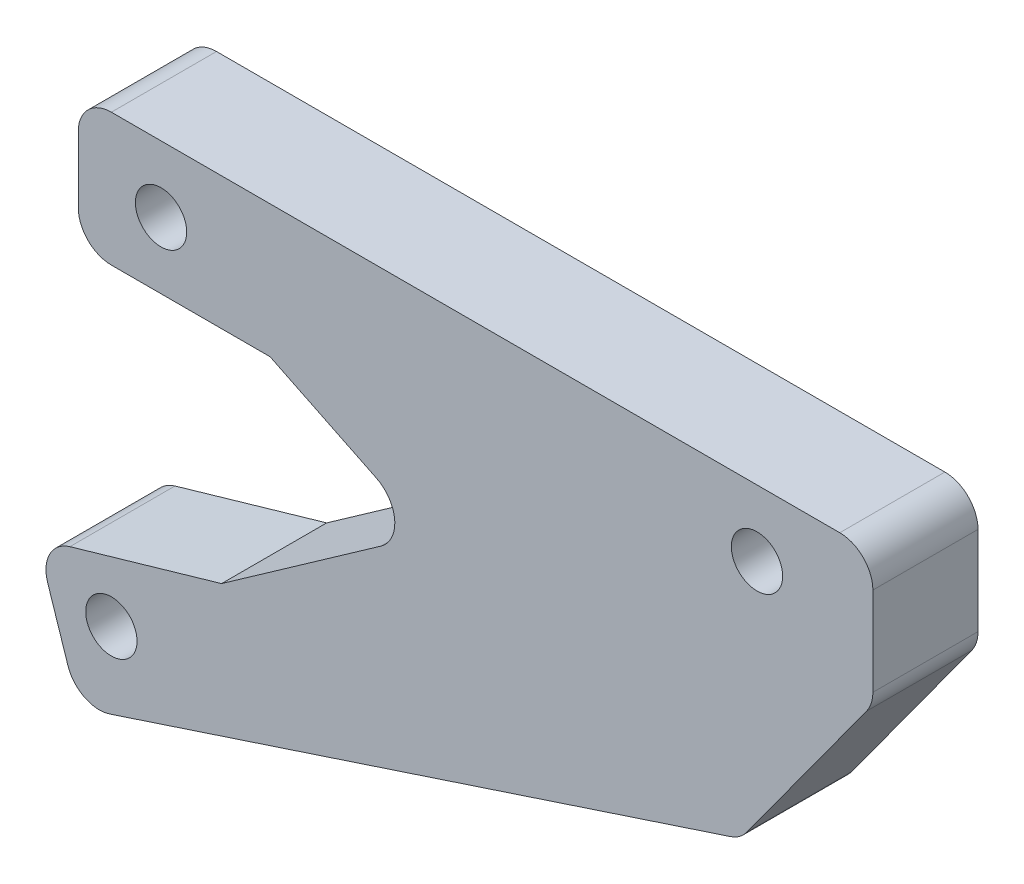
ISO-10303-21;
HEADER;
FILE_DESCRIPTION(('STEP AP214'),'2;1');
FILE_NAME('part.step','',(''),(''),'','','');
FILE_SCHEMA(('AUTOMOTIVE_DESIGN { 1 0 10303 214 1 1 1 1 }'));
ENDSEC;
DATA;
#1=APPLICATION_CONTEXT('core data for automotive mechanical design processes');
#2=APPLICATION_PROTOCOL_DEFINITION('international standard','automotive_design',2000,#1);
#3=PRODUCT_CONTEXT('',#1,'mechanical');
#4=PRODUCT('Part','Part','',(#3));
#5=PRODUCT_RELATED_PRODUCT_CATEGORY('part','',(#4));
#6=PRODUCT_DEFINITION_FORMATION('','',#4);
#7=PRODUCT_DEFINITION_CONTEXT('part definition',#1,'design');
#8=PRODUCT_DEFINITION('design','',#6,#7);
#9=PRODUCT_DEFINITION_SHAPE('','',#8);
#10=(LENGTH_UNIT() NAMED_UNIT(*) SI_UNIT(.MILLI.,.METRE.));
#11=(NAMED_UNIT(*) PLANE_ANGLE_UNIT() SI_UNIT($,.RADIAN.));
#12=(NAMED_UNIT(*) SI_UNIT($,.STERADIAN.) SOLID_ANGLE_UNIT());
#13=UNCERTAINTY_MEASURE_WITH_UNIT(LENGTH_MEASURE(1.E-05),#10,'distance_accuracy_value','');
#14=(GEOMETRIC_REPRESENTATION_CONTEXT(3) GLOBAL_UNCERTAINTY_ASSIGNED_CONTEXT((#13)) GLOBAL_UNIT_ASSIGNED_CONTEXT((#10,
#11,#12)) REPRESENTATION_CONTEXT('',''));
#15=CARTESIAN_POINT('',(0.,0.,0.));
#16=DIRECTION('',(0.,0.,1.));
#17=DIRECTION('',(1.,0.,0.));
#18=AXIS2_PLACEMENT_3D('',#15,#16,#17);
#19=CARTESIAN_POINT('',(24.,4.,6.35));
#20=DIRECTION('',(-1.,0.,0.));
#21=DIRECTION('',(0.,-1.,0.));
#22=AXIS2_PLACEMENT_3D('',#19,#20,#21);
#23=PLANE('',#22);
#24=DIRECTION('',(0.,1.,0.));
#25=VECTOR('',#24,1.);
#26=CARTESIAN_POINT('',(24.,4.,6.35));
#27=LINE('',#26,#25);
#28=CARTESIAN_POINT('',(24.,-3.34963237281614,6.35));
#29=VERTEX_POINT('',#28);
#30=CARTESIAN_POINT('',(24.,2.,6.35));
#31=VERTEX_POINT('',#30);
#32=EDGE_CURVE('E205',#29,#31,#27,.T.);
#33=ORIENTED_EDGE('',*,*,#32,.F.);
#34=DIRECTION('',(0.,0.,-1.));
#35=VECTOR('',#34,1.);
#36=CARTESIAN_POINT('',(24.,-3.34963237281614,6.35));
#37=LINE('',#36,#35);
#38=CARTESIAN_POINT('',(24.,-3.34963237281614,0.));
#39=VERTEX_POINT('',#38);
#40=EDGE_CURVE('E310',#29,#39,#37,.T.);
#41=ORIENTED_EDGE('',*,*,#40,.T.);
#42=DIRECTION('',(0.,1.,0.));
#43=VECTOR('',#42,1.);
#44=CARTESIAN_POINT('',(24.,4.,0.));
#45=LINE('',#44,#43);
#46=CARTESIAN_POINT('',(24.,2.,0.));
#47=VERTEX_POINT('',#46);
#48=EDGE_CURVE('E226',#39,#47,#45,.T.);
#49=ORIENTED_EDGE('',*,*,#48,.T.);
#50=DIRECTION('',(0.,0.,-1.));
#51=VECTOR('',#50,1.);
#52=CARTESIAN_POINT('',(24.,2.,6.35));
#53=LINE('',#52,#51);
#54=EDGE_CURVE('E50',#47,#31,#53,.F.);
#55=ORIENTED_EDGE('',*,*,#54,.T.);
#56=EDGE_LOOP('',(#33,#41,#49,#55));
#57=FACE_BOUND('',#56,.T.);
#58=ADVANCED_FACE('F35',(#57),#23,.F.);
#59=CARTESIAN_POINT('',(-24.,4.,6.35));
#60=DIRECTION('',(0.,-1.,0.));
#61=DIRECTION('',(0.,0.,-1.));
#62=AXIS2_PLACEMENT_3D('',#59,#60,#61);
#63=PLANE('',#62);
#64=DIRECTION('',(-1.,0.,0.));
#65=VECTOR('',#64,1.);
#66=CARTESIAN_POINT('',(-24.,4.,0.));
#67=LINE('',#66,#65);
#68=CARTESIAN_POINT('',(22.,4.,0.));
#69=VERTEX_POINT('',#68);
#70=CARTESIAN_POINT('',(-22.,4.,0.));
#71=VERTEX_POINT('',#70);
#72=EDGE_CURVE('E228',#69,#71,#67,.T.);
#73=ORIENTED_EDGE('',*,*,#72,.T.);
#74=DIRECTION('',(0.,0.,-1.));
#75=VECTOR('',#74,1.);
#76=CARTESIAN_POINT('',(-22.,4.,6.35));
#77=LINE('',#76,#75);
#78=CARTESIAN_POINT('',(-22.,4.,6.35));
#79=VERTEX_POINT('',#78);
#80=EDGE_CURVE('E274',#71,#79,#77,.F.);
#81=ORIENTED_EDGE('',*,*,#80,.T.);
#82=DIRECTION('',(-1.,0.,0.));
#83=VECTOR('',#82,1.);
#84=CARTESIAN_POINT('',(-24.,4.,6.35));
#85=LINE('',#84,#83);
#86=CARTESIAN_POINT('',(22.,4.,6.35));
#87=VERTEX_POINT('',#86);
#88=EDGE_CURVE('E207',#87,#79,#85,.T.);
#89=ORIENTED_EDGE('',*,*,#88,.F.);
#90=DIRECTION('',(0.,0.,-1.));
#91=VECTOR('',#90,1.);
#92=CARTESIAN_POINT('',(22.,4.,6.35));
#93=LINE('',#92,#91);
#94=EDGE_CURVE('E271',#87,#69,#93,.T.);
#95=ORIENTED_EDGE('',*,*,#94,.T.);
#96=EDGE_LOOP('',(#73,#81,#89,#95));
#97=FACE_BOUND('',#96,.T.);
#98=ADVANCED_FACE('F346',(#97),#63,.F.);
#99=CARTESIAN_POINT('',(-24.,4.,6.35));
#100=DIRECTION('',(1.,0.,0.));
#101=DIRECTION('',(0.,0.,-1.));
#102=AXIS2_PLACEMENT_3D('',#99,#100,#101);
#103=PLANE('',#102);
#104=DIRECTION('',(0.,-1.,0.));
#105=VECTOR('',#104,1.);
#106=CARTESIAN_POINT('',(-24.,4.,6.35));
#107=LINE('',#106,#105);
#108=CARTESIAN_POINT('',(-24.,2.,6.35));
#109=VERTEX_POINT('',#108);
#110=CARTESIAN_POINT('',(-24.,-2.,6.35));
#111=VERTEX_POINT('',#110);
#112=EDGE_CURVE('E211',#109,#111,#107,.T.);
#113=ORIENTED_EDGE('',*,*,#112,.F.);
#114=DIRECTION('',(0.,0.,-1.));
#115=VECTOR('',#114,1.);
#116=CARTESIAN_POINT('',(-24.,2.,6.35));
#117=LINE('',#116,#115);
#118=CARTESIAN_POINT('',(-24.,2.,0.));
#119=VERTEX_POINT('',#118);
#120=EDGE_CURVE('E255',#109,#119,#117,.T.);
#121=ORIENTED_EDGE('',*,*,#120,.T.);
#122=DIRECTION('',(0.,-1.,0.));
#123=VECTOR('',#122,1.);
#124=CARTESIAN_POINT('',(-24.,4.,0.));
#125=LINE('',#124,#123);
#126=CARTESIAN_POINT('',(-24.,-2.,0.));
#127=VERTEX_POINT('',#126);
#128=EDGE_CURVE('E232',#119,#127,#125,.T.);
#129=ORIENTED_EDGE('',*,*,#128,.T.);
#130=DIRECTION('',(0.,0.,-1.));
#131=VECTOR('',#130,1.);
#132=CARTESIAN_POINT('',(-24.,-2.,6.35));
#133=LINE('',#132,#131);
#134=EDGE_CURVE('E253',#127,#111,#133,.F.);
#135=ORIENTED_EDGE('',*,*,#134,.T.);
#136=EDGE_LOOP('',(#113,#121,#129,#135));
#137=FACE_BOUND('',#136,.T.);
#138=ADVANCED_FACE('F336',(#137),#103,.F.);
#139=CARTESIAN_POINT('',(-24.,-4.,6.35));
#140=DIRECTION('',(0.,1.,0.));
#141=DIRECTION('',(0.,0.,1.));
#142=AXIS2_PLACEMENT_3D('',#139,#140,#141);
#143=PLANE('',#142);
#144=DIRECTION('',(1.,0.,0.));
#145=VECTOR('',#144,1.);
#146=CARTESIAN_POINT('',(-24.,-4.,6.35));
#147=LINE('',#146,#145);
#148=CARTESIAN_POINT('',(-22.,-4.,6.35));
#149=VERTEX_POINT('',#148);
#150=CARTESIAN_POINT('',(-12.4163745866691,-4.,6.35));
#151=VERTEX_POINT('',#150);
#152=EDGE_CURVE('E214',#149,#151,#147,.T.);
#153=ORIENTED_EDGE('',*,*,#152,.F.);
#154=DIRECTION('',(0.,0.,-1.));
#155=VECTOR('',#154,1.);
#156=CARTESIAN_POINT('',(-22.,-4.,6.35));
#157=LINE('',#156,#155);
#158=CARTESIAN_POINT('',(-22.,-4.,0.));
#159=VERTEX_POINT('',#158);
#160=EDGE_CURVE('E289',#149,#159,#157,.T.);
#161=ORIENTED_EDGE('',*,*,#160,.T.);
#162=DIRECTION('',(1.,0.,0.));
#163=VECTOR('',#162,1.);
#164=CARTESIAN_POINT('',(-24.,-4.,0.));
#165=LINE('',#164,#163);
#166=CARTESIAN_POINT('',(-12.4163745866691,-4.,0.));
#167=VERTEX_POINT('',#166);
#168=EDGE_CURVE('E173',#159,#167,#165,.T.);
#169=ORIENTED_EDGE('',*,*,#168,.T.);
#170=DIRECTION('',(0.,0.,1.));
#171=VECTOR('',#170,1.);
#172=CARTESIAN_POINT('',(-12.4163745866691,-4.,-32.2295189347304));
#173=LINE('',#172,#171);
#174=EDGE_CURVE('E183',#167,#151,#173,.T.);
#175=ORIENTED_EDGE('',*,*,#174,.T.);
#176=EDGE_LOOP('',(#153,#161,#169,#175));
#177=FACE_BOUND('',#176,.T.);
#178=ADVANCED_FACE('F330',(#177),#143,.F.);
#179=CARTESIAN_POINT('',(-26.5,-20.5596918224101,6.35));
#180=DIRECTION('',(0.277910002796559,-0.960607115498119,0.));
#181=DIRECTION('',(0.960607115498119,0.27791000279656,0.));
#182=AXIS2_PLACEMENT_3D('',#179,#180,#181);
#183=PLANE('',#182);
#184=DIRECTION('',(-0.960607115498119,-0.27791000279656,0.));
#185=VECTOR('',#184,1.);
#186=CARTESIAN_POINT('',(-26.5,-20.5596918224101,0.));
#187=LINE('',#186,#185);
#188=CARTESIAN_POINT('',(-15.3428605825562,-17.3318574698657,0.));
#189=VERTEX_POINT('',#188);
#190=CARTESIAN_POINT('',(-24.5079359802819,-19.9833745035406,0.));
#191=VERTEX_POINT('',#190);
#192=EDGE_CURVE('E161',#189,#191,#187,.T.);
#193=ORIENTED_EDGE('',*,*,#192,.T.);
#194=DIRECTION('',(0.,0.,-1.));
#195=VECTOR('',#194,1.);
#196=CARTESIAN_POINT('',(-24.5079359802819,-19.9833745035406,6.35));
#197=LINE('',#196,#195);
#198=CARTESIAN_POINT('',(-24.5079359802819,-19.9833745035406,6.35));
#199=VERTEX_POINT('',#198);
#200=EDGE_CURVE('E297',#191,#199,#197,.F.);
#201=ORIENTED_EDGE('',*,*,#200,.T.);
#202=DIRECTION('',(-0.960607115498119,-0.27791000279656,0.));
#203=VECTOR('',#202,1.);
#204=CARTESIAN_POINT('',(-26.5,-20.5596918224101,6.35));
#205=LINE('',#204,#203);
#206=CARTESIAN_POINT('',(-15.3428605825562,-17.3318574698657,6.35));
#207=VERTEX_POINT('',#206);
#208=EDGE_CURVE('E180',#207,#199,#205,.T.);
#209=ORIENTED_EDGE('',*,*,#208,.F.);
#210=DIRECTION('',(0.,0.,1.));
#211=VECTOR('',#210,1.);
#212=CARTESIAN_POINT('',(-15.3428605825562,-17.3318574698657,-32.2295189347304));
#213=LINE('',#212,#211);
#214=EDGE_CURVE('E177',#189,#207,#213,.T.);
#215=ORIENTED_EDGE('',*,*,#214,.F.);
#216=EDGE_LOOP('',(#193,#201,#209,#215));
#217=FACE_BOUND('',#216,.T.);
#218=ADVANCED_FACE('F178',(#217),#183,.F.);
#219=CARTESIAN_POINT('',(-24.,-28.1590338991954,6.35));
#220=DIRECTION('',(0.949917759598166,0.312500000000001,0.));
#221=DIRECTION('',(-0.312500000000001,0.949917759598166,0.));
#222=AXIS2_PLACEMENT_3D('',#219,#220,#221);
#223=PLANE('',#222);
#224=DIRECTION('',(0.312500000000001,-0.949917759598166,0.));
#225=VECTOR('',#224,1.);
#226=CARTESIAN_POINT('',(-24.,-28.1590338991954,6.35));
#227=LINE('',#226,#225);
#228=CARTESIAN_POINT('',(-25.8519514938851,-22.5295887345369,6.35));
#229=VERTEX_POINT('',#228);
#230=CARTESIAN_POINT('',(-24.625,-26.2591983799991,6.35));
#231=VERTEX_POINT('',#230);
#232=EDGE_CURVE('E217',#229,#231,#227,.T.);
#233=ORIENTED_EDGE('',*,*,#232,.F.);
#234=DIRECTION('',(0.,0.,-1.));
#235=VECTOR('',#234,1.);
#236=CARTESIAN_POINT('',(-25.8519514938851,-22.5295887345369,6.35));
#237=LINE('',#236,#235);
#238=CARTESIAN_POINT('',(-25.8519514938851,-22.5295887345369,0.));
#239=VERTEX_POINT('',#238);
#240=EDGE_CURVE('E294',#229,#239,#237,.T.);
#241=ORIENTED_EDGE('',*,*,#240,.T.);
#242=DIRECTION('',(0.312500000000001,-0.949917759598166,0.));
#243=VECTOR('',#242,1.);
#244=CARTESIAN_POINT('',(-24.,-28.1590338991954,0.));
#245=LINE('',#244,#243);
#246=CARTESIAN_POINT('',(-24.625,-26.2591983799991,0.));
#247=VERTEX_POINT('',#246);
#248=EDGE_CURVE('E172',#239,#247,#245,.T.);
#249=ORIENTED_EDGE('',*,*,#248,.T.);
#250=DIRECTION('',(0.,0.,-1.));
#251=VECTOR('',#250,1.);
#252=CARTESIAN_POINT('',(-24.625,-26.2591983799991,6.35));
#253=LINE('',#252,#251);
#254=EDGE_CURVE('E292',#247,#231,#253,.F.);
#255=ORIENTED_EDGE('',*,*,#254,.T.);
#256=EDGE_LOOP('',(#233,#241,#249,#255));
#257=FACE_BOUND('',#256,.T.);
#258=ADVANCED_FACE('F376',(#257),#223,.F.);
#259=CARTESIAN_POINT('',(16.,-15.,6.35));
#260=DIRECTION('',(-0.312500000000001,0.949917759598166,0.));
#261=DIRECTION('',(-0.949917759598166,-0.312500000000001,0.));
#262=AXIS2_PLACEMENT_3D('',#259,#260,#261);
#263=PLANE('',#262);
#264=DIRECTION('',(0.949917759598166,0.312500000000001,0.));
#265=VECTOR('',#264,1.);
#266=CARTESIAN_POINT('',(16.,-15.,6.35));
#267=LINE('',#266,#265);
#268=CARTESIAN_POINT('',(-22.1001644808037,-27.5340338991954,6.35));
#269=VERTEX_POINT('',#268);
#270=CARTESIAN_POINT('',(15.3870532468654,-15.2016446775725,6.35));
#271=VERTEX_POINT('',#270);
#272=EDGE_CURVE('E220',#269,#271,#267,.T.);
#273=ORIENTED_EDGE('',*,*,#272,.F.);
#274=DIRECTION('',(0.,0.,-1.));
#275=VECTOR('',#274,1.);
#276=CARTESIAN_POINT('',(-22.1001644808037,-27.5340338991954,6.35));
#277=LINE('',#276,#275);
#278=CARTESIAN_POINT('',(-22.1001644808037,-27.5340338991954,0.));
#279=VERTEX_POINT('',#278);
#280=EDGE_CURVE('E301',#269,#279,#277,.T.);
#281=ORIENTED_EDGE('',*,*,#280,.T.);
#282=DIRECTION('',(0.949917759598166,0.312500000000001,0.));
#283=VECTOR('',#282,1.);
#284=CARTESIAN_POINT('',(16.,-15.,0.));
#285=LINE('',#284,#283);
#286=CARTESIAN_POINT('',(15.3870532468654,-15.2016446775725,0.));
#287=VERTEX_POINT('',#286);
#288=EDGE_CURVE('E238',#279,#287,#285,.T.);
#289=ORIENTED_EDGE('',*,*,#288,.T.);
#290=DIRECTION('',(0.,0.,-1.));
#291=VECTOR('',#290,1.);
#292=CARTESIAN_POINT('',(15.3870532468654,-15.2016446775725,6.35));
#293=LINE('',#292,#291);
#294=EDGE_CURVE('E299',#287,#271,#293,.F.);
#295=ORIENTED_EDGE('',*,*,#294,.T.);
#296=EDGE_LOOP('',(#273,#281,#289,#295));
#297=FACE_BOUND('',#296,.T.);
#298=ADVANCED_FACE('F368',(#297),#263,.F.);
#299=CARTESIAN_POINT('',(24.,-4.,6.35));
#300=DIRECTION('',(-0.808736084303188,0.588171697675047,0.));
#301=DIRECTION('',(-0.588171697675047,-0.808736084303188,0.));
#302=AXIS2_PLACEMENT_3D('',#299,#300,#301);
#303=PLANE('',#302);
#304=DIRECTION('',(0.588171697675047,0.808736084303188,0.));
#305=VECTOR('',#304,1.);
#306=CARTESIAN_POINT('',(24.,-4.,6.35));
#307=LINE('',#306,#305);
#308=CARTESIAN_POINT('',(16.3795254154718,-14.4781525537262,6.35));
#309=VERTEX_POINT('',#308);
#310=CARTESIAN_POINT('',(23.6174721686064,-4.52597576816623,6.35));
#311=VERTEX_POINT('',#310);
#312=EDGE_CURVE('E223',#309,#311,#307,.T.);
#313=ORIENTED_EDGE('',*,*,#312,.F.);
#314=DIRECTION('',(0.,0.,-1.));
#315=VECTOR('',#314,1.);
#316=CARTESIAN_POINT('',(16.3795254154718,-14.4781525537262,6.35));
#317=LINE('',#316,#315);
#318=CARTESIAN_POINT('',(16.3795254154718,-14.4781525537262,0.));
#319=VERTEX_POINT('',#318);
#320=EDGE_CURVE('E306',#309,#319,#317,.T.);
#321=ORIENTED_EDGE('',*,*,#320,.T.);
#322=DIRECTION('',(0.588171697675047,0.808736084303188,0.));
#323=VECTOR('',#322,1.);
#324=CARTESIAN_POINT('',(24.,-4.,0.));
#325=LINE('',#324,#323);
#326=CARTESIAN_POINT('',(23.6174721686064,-4.52597576816623,0.));
#327=VERTEX_POINT('',#326);
#328=EDGE_CURVE('E208',#319,#327,#325,.T.);
#329=ORIENTED_EDGE('',*,*,#328,.T.);
#330=DIRECTION('',(0.,0.,-1.));
#331=VECTOR('',#330,1.);
#332=CARTESIAN_POINT('',(23.6174721686064,-4.52597576816623,6.35));
#333=LINE('',#332,#331);
#334=EDGE_CURVE('E304',#327,#311,#333,.F.);
#335=ORIENTED_EDGE('',*,*,#334,.T.);
#336=EDGE_LOOP('',(#313,#321,#329,#335));
#337=FACE_BOUND('',#336,.T.);
#338=ADVANCED_FACE('F359',(#337),#303,.F.);
#339=CARTESIAN_POINT('',(0.,0.,6.35));
#340=DIRECTION('',(0.,0.,1.));
#341=DIRECTION('',(1.,0.,0.));
#342=AXIS2_PLACEMENT_3D('',#339,#340,#341);
#343=PLANE('',#342);
#344=ORIENTED_EDGE('',*,*,#88,.T.);
#345=CARTESIAN_POINT('',(-22.,2.,6.35));
#346=DIRECTION('',(0.,0.,1.));
#347=DIRECTION('',(1.,0.,0.));
#348=AXIS2_PLACEMENT_3D('',#345,#346,#347);
#349=CIRCLE('',#348,2.);
#350=EDGE_CURVE('E287',#79,#109,#349,.T.);
#351=ORIENTED_EDGE('',*,*,#350,.T.);
#352=ORIENTED_EDGE('',*,*,#112,.T.);
#353=CARTESIAN_POINT('',(-22.,-2.,6.35));
#354=DIRECTION('',(0.,0.,1.));
#355=DIRECTION('',(1.,0.,0.));
#356=AXIS2_PLACEMENT_3D('',#353,#354,#355);
#357=CIRCLE('',#356,2.);
#358=EDGE_CURVE('E285',#111,#149,#357,.T.);
#359=ORIENTED_EDGE('',*,*,#358,.T.);
#360=ORIENTED_EDGE('',*,*,#152,.T.);
#361=DIRECTION('',(0.898613397941207,-0.438741337282639,0.));
#362=VECTOR('',#361,1.);
#363=CARTESIAN_POINT('',(-12.4163745866691,-4.,6.35));
#364=LINE('',#363,#362);
#365=CARTESIAN_POINT('',(-6.00016487150099,-7.13266688118408,6.35));
#366=VERTEX_POINT('',#365);
#367=EDGE_CURVE('E316',#151,#366,#364,.T.);
#368=ORIENTED_EDGE('',*,*,#367,.T.);
#369=CARTESIAN_POINT('',(-6.87764754606626,-8.9298936770665,6.35));
#370=DIRECTION('',(0.,0.,1.));
#371=DIRECTION('',(1.,0.,0.));
#372=AXIS2_PLACEMENT_3D('',#369,#370,#371);
#373=CIRCLE('',#372,2.);
#374=CARTESIAN_POINT('',(-5.72672950253974,-10.5655549063818,6.35));
#375=VERTEX_POINT('',#374);
#376=EDGE_CURVE('E43',#366,#375,#373,.F.);
#377=ORIENTED_EDGE('',*,*,#376,.T.);
#378=DIRECTION('',(-0.817830614657627,-0.575459021763259,0.));
#379=VECTOR('',#378,1.);
#380=CARTESIAN_POINT('',(-2.95851817362701,-8.6177283579259,6.35));
#381=LINE('',#380,#379);
#382=EDGE_CURVE('E184',#375,#207,#381,.T.);
#383=ORIENTED_EDGE('',*,*,#382,.T.);
#384=ORIENTED_EDGE('',*,*,#208,.T.);
#385=CARTESIAN_POINT('',(-23.9521159746888,-21.9045887345369,6.35));
#386=DIRECTION('',(0.,0.,1.));
#387=DIRECTION('',(1.,0.,0.));
#388=AXIS2_PLACEMENT_3D('',#385,#386,#387);
#389=CIRCLE('',#388,2.);
#390=EDGE_CURVE('E283',#199,#229,#389,.T.);
#391=ORIENTED_EDGE('',*,*,#390,.T.);
#392=ORIENTED_EDGE('',*,*,#232,.T.);
#393=CARTESIAN_POINT('',(-22.7251644808037,-25.6341983799991,6.35));
#394=DIRECTION('',(0.,0.,1.));
#395=DIRECTION('',(1.,0.,0.));
#396=AXIS2_PLACEMENT_3D('',#393,#394,#395);
#397=CIRCLE('',#396,2.);
#398=EDGE_CURVE('E281',#231,#269,#397,.T.);
#399=ORIENTED_EDGE('',*,*,#398,.T.);
#400=ORIENTED_EDGE('',*,*,#272,.T.);
#401=CARTESIAN_POINT('',(14.7620532468654,-13.3018091583761,6.35));
#402=DIRECTION('',(0.,0.,1.));
#403=DIRECTION('',(1.,0.,0.));
#404=AXIS2_PLACEMENT_3D('',#401,#402,#403);
#405=CIRCLE('',#404,2.);
#406=EDGE_CURVE('E279',#271,#309,#405,.T.);
#407=ORIENTED_EDGE('',*,*,#406,.T.);
#408=ORIENTED_EDGE('',*,*,#312,.T.);
#409=CARTESIAN_POINT('',(22.,-3.34963237281614,6.35));
#410=DIRECTION('',(0.,0.,1.));
#411=DIRECTION('',(1.,0.,0.));
#412=AXIS2_PLACEMENT_3D('',#409,#410,#411);
#413=CIRCLE('',#412,2.);
#414=EDGE_CURVE('E57',#311,#29,#413,.T.);
#415=ORIENTED_EDGE('',*,*,#414,.T.);
#416=ORIENTED_EDGE('',*,*,#32,.T.);
#417=CARTESIAN_POINT('',(22.,2.,6.35));
#418=DIRECTION('',(0.,0.,1.));
#419=DIRECTION('',(1.,0.,0.));
#420=AXIS2_PLACEMENT_3D('',#417,#418,#419);
#421=CIRCLE('',#420,2.);
#422=EDGE_CURVE('E276',#31,#87,#421,.T.);
#423=ORIENTED_EDGE('',*,*,#422,.T.);
#424=EDGE_LOOP('',(#344,#351,#352,#359,#360,#368,#377,#383,#384,#391,#392,#399,#400,#407,#408,
#415,#416,#423));
#425=FACE_BOUND('',#424,.T.);
#426=CARTESIAN_POINT('',(-22.,-22.9013411305656,6.35));
#427=DIRECTION('',(0.,0.,1.));
#428=DIRECTION('',(1.,0.,0.));
#429=AXIS2_PLACEMENT_3D('',#426,#427,#428);
#430=CIRCLE('',#429,1.55);
#431=CARTESIAN_POINT('',(-20.45,-22.9013411305656,6.35));
#432=VERTEX_POINT('',#431);
#433=EDGE_CURVE('E189',#432,#432,#430,.T.);
#434=ORIENTED_EDGE('',*,*,#433,.F.);
#435=EDGE_LOOP('',(#434));
#436=FACE_BOUND('',#435,.T.);
#437=CARTESIAN_POINT('',(17.,0.,6.35));
#438=DIRECTION('',(0.,0.,1.));
#439=DIRECTION('',(1.,0.,0.));
#440=AXIS2_PLACEMENT_3D('',#437,#438,#439);
#441=CIRCLE('',#440,1.55);
#442=CARTESIAN_POINT('',(18.55,0.,6.35));
#443=VERTEX_POINT('',#442);
#444=EDGE_CURVE('E193',#443,#443,#441,.T.);
#445=ORIENTED_EDGE('',*,*,#444,.F.);
#446=EDGE_LOOP('',(#445));
#447=FACE_BOUND('',#446,.T.);
#448=CARTESIAN_POINT('',(-19.,0.,6.35));
#449=DIRECTION('',(0.,0.,1.));
#450=DIRECTION('',(1.,0.,0.));
#451=AXIS2_PLACEMENT_3D('',#448,#449,#450);
#452=CIRCLE('',#451,1.55);
#453=CARTESIAN_POINT('',(-17.45,0.,6.35));
#454=VERTEX_POINT('',#453);
#455=EDGE_CURVE('E200',#454,#454,#452,.T.);
#456=ORIENTED_EDGE('',*,*,#455,.F.);
#457=EDGE_LOOP('',(#456));
#458=FACE_BOUND('',#457,.T.);
#459=ADVANCED_FACE('F313',(#425,#436,#447,#458),#343,.T.);
#460=CARTESIAN_POINT('',(0.,0.,0.));
#461=DIRECTION('',(0.,0.,1.));
#462=DIRECTION('',(1.,0.,0.));
#463=AXIS2_PLACEMENT_3D('',#460,#461,#462);
#464=PLANE('',#463);
#465=CARTESIAN_POINT('',(-22.,-22.9013411305656,0.));
#466=DIRECTION('',(0.,0.,1.));
#467=DIRECTION('',(1.,0.,0.));
#468=AXIS2_PLACEMENT_3D('',#465,#466,#467);
#469=CIRCLE('',#468,1.55);
#470=CARTESIAN_POINT('',(-20.45,-22.9013411305656,0.));
#471=VERTEX_POINT('',#470);
#472=EDGE_CURVE('E229',#471,#471,#469,.T.);
#473=ORIENTED_EDGE('',*,*,#472,.T.);
#474=EDGE_LOOP('',(#473));
#475=FACE_BOUND('',#474,.T.);
#476=CARTESIAN_POINT('',(17.,0.,0.));
#477=DIRECTION('',(0.,0.,1.));
#478=DIRECTION('',(1.,0.,0.));
#479=AXIS2_PLACEMENT_3D('',#476,#477,#478);
#480=CIRCLE('',#479,1.55);
#481=CARTESIAN_POINT('',(18.55,0.,0.));
#482=VERTEX_POINT('',#481);
#483=EDGE_CURVE('E245',#482,#482,#480,.T.);
#484=ORIENTED_EDGE('',*,*,#483,.T.);
#485=EDGE_LOOP('',(#484));
#486=FACE_BOUND('',#485,.T.);
#487=CARTESIAN_POINT('',(-19.,0.,0.));
#488=DIRECTION('',(0.,0.,1.));
#489=DIRECTION('',(1.,0.,0.));
#490=AXIS2_PLACEMENT_3D('',#487,#488,#489);
#491=CIRCLE('',#490,1.55);
#492=CARTESIAN_POINT('',(-17.45,0.,0.));
#493=VERTEX_POINT('',#492);
#494=EDGE_CURVE('E204',#493,#493,#491,.T.);
#495=ORIENTED_EDGE('',*,*,#494,.T.);
#496=EDGE_LOOP('',(#495));
#497=FACE_BOUND('',#496,.T.);
#498=ORIENTED_EDGE('',*,*,#128,.F.);
#499=CARTESIAN_POINT('',(-22.,2.,0.));
#500=DIRECTION('',(0.,0.,1.));
#501=DIRECTION('',(1.,0.,0.));
#502=AXIS2_PLACEMENT_3D('',#499,#500,#501);
#503=CIRCLE('',#502,2.);
#504=EDGE_CURVE('E269',#119,#71,#503,.F.);
#505=ORIENTED_EDGE('',*,*,#504,.T.);
#506=ORIENTED_EDGE('',*,*,#72,.F.);
#507=CARTESIAN_POINT('',(22.,2.,0.));
#508=DIRECTION('',(0.,0.,1.));
#509=DIRECTION('',(1.,0.,0.));
#510=AXIS2_PLACEMENT_3D('',#507,#508,#509);
#511=CIRCLE('',#510,2.);
#512=EDGE_CURVE('E258',#69,#47,#511,.F.);
#513=ORIENTED_EDGE('',*,*,#512,.T.);
#514=ORIENTED_EDGE('',*,*,#48,.F.);
#515=CARTESIAN_POINT('',(22.,-3.34963237281614,0.));
#516=DIRECTION('',(0.,0.,1.));
#517=DIRECTION('',(1.,0.,0.));
#518=AXIS2_PLACEMENT_3D('',#515,#516,#517);
#519=CIRCLE('',#518,2.);
#520=EDGE_CURVE('E260',#39,#327,#519,.F.);
#521=ORIENTED_EDGE('',*,*,#520,.T.);
#522=ORIENTED_EDGE('',*,*,#328,.F.);
#523=CARTESIAN_POINT('',(14.7620532468654,-13.3018091583761,0.));
#524=DIRECTION('',(0.,0.,1.));
#525=DIRECTION('',(1.,0.,0.));
#526=AXIS2_PLACEMENT_3D('',#523,#524,#525);
#527=CIRCLE('',#526,2.);
#528=EDGE_CURVE('E262',#319,#287,#527,.F.);
#529=ORIENTED_EDGE('',*,*,#528,.T.);
#530=ORIENTED_EDGE('',*,*,#288,.F.);
#531=CARTESIAN_POINT('',(-22.7251644808037,-25.6341983799991,0.));
#532=DIRECTION('',(0.,0.,1.));
#533=DIRECTION('',(1.,0.,0.));
#534=AXIS2_PLACEMENT_3D('',#531,#532,#533);
#535=CIRCLE('',#534,2.);
#536=EDGE_CURVE('E264',#279,#247,#535,.F.);
#537=ORIENTED_EDGE('',*,*,#536,.T.);
#538=ORIENTED_EDGE('',*,*,#248,.F.);
#539=CARTESIAN_POINT('',(-23.9521159746888,-21.9045887345369,0.));
#540=DIRECTION('',(0.,0.,1.));
#541=DIRECTION('',(1.,0.,0.));
#542=AXIS2_PLACEMENT_3D('',#539,#540,#541);
#543=CIRCLE('',#542,2.);
#544=EDGE_CURVE('E169',#239,#191,#543,.F.);
#545=ORIENTED_EDGE('',*,*,#544,.T.);
#546=ORIENTED_EDGE('',*,*,#192,.F.);
#547=DIRECTION('',(0.817830614657627,0.575459021763259,0.));
#548=VECTOR('',#547,1.);
#549=CARTESIAN_POINT('',(-2.95851817362701,-8.6177283579259,0.));
#550=LINE('',#549,#548);
#551=CARTESIAN_POINT('',(-5.72672950253974,-10.5655549063818,0.));
#552=VERTEX_POINT('',#551);
#553=EDGE_CURVE('E166',#189,#552,#550,.T.);
#554=ORIENTED_EDGE('',*,*,#553,.T.);
#555=CARTESIAN_POINT('',(-6.87764754606626,-8.9298936770665,0.));
#556=DIRECTION('',(0.,0.,1.));
#557=DIRECTION('',(1.,0.,0.));
#558=AXIS2_PLACEMENT_3D('',#555,#556,#557);
#559=CIRCLE('',#558,2.);
#560=CARTESIAN_POINT('',(-6.00016487150099,-7.13266688118408,0.));
#561=VERTEX_POINT('',#560);
#562=EDGE_CURVE('E11',#552,#561,#559,.T.);
#563=ORIENTED_EDGE('',*,*,#562,.T.);
#564=DIRECTION('',(-0.898613397941207,0.438741337282639,0.));
#565=VECTOR('',#564,1.);
#566=CARTESIAN_POINT('',(-12.4163745866691,-4.,0.));
#567=LINE('',#566,#565);
#568=EDGE_CURVE('E190',#561,#167,#567,.T.);
#569=ORIENTED_EDGE('',*,*,#568,.T.);
#570=ORIENTED_EDGE('',*,*,#168,.F.);
#571=CARTESIAN_POINT('',(-22.,-2.,0.));
#572=DIRECTION('',(0.,0.,1.));
#573=DIRECTION('',(1.,0.,0.));
#574=AXIS2_PLACEMENT_3D('',#571,#572,#573);
#575=CIRCLE('',#574,2.);
#576=EDGE_CURVE('E267',#159,#127,#575,.F.);
#577=ORIENTED_EDGE('',*,*,#576,.T.);
#578=EDGE_LOOP('',(#498,#505,#506,#513,#514,#521,#522,#529,#530,#537,#538,#545,#546,#554,#563,
#569,#570,#577));
#579=FACE_BOUND('',#578,.T.);
#580=ADVANCED_FACE('F164',(#475,#486,#497,#579),#464,.F.);
#581=CARTESIAN_POINT('',(-19.,0.,-1.2E-05));
#582=DIRECTION('',(0.,0.,1.));
#583=DIRECTION('',(1.,0.,0.));
#584=AXIS2_PLACEMENT_3D('',#581,#582,#583);
#585=CYLINDRICAL_SURFACE('',#584,1.55);
#586=CARTESIAN_POINT('',(-17.45,0.,6.35));
#587=CARTESIAN_POINT('',(-17.45,0.,6.28385416666667));
#588=CARTESIAN_POINT('',(-17.45,0.,6.21770833333333));
#589=CARTESIAN_POINT('',(-17.45,0.,6.08541666666667));
#590=CARTESIAN_POINT('',(-17.45,0.,6.01927083333333));
#591=CARTESIAN_POINT('',(-17.45,0.,5.88697916666667));
#592=CARTESIAN_POINT('',(-17.45,0.,5.82083333333333));
#593=CARTESIAN_POINT('',(-17.45,0.,5.68854166666667));
#594=CARTESIAN_POINT('',(-17.45,0.,5.62239583333333));
#595=CARTESIAN_POINT('',(-17.45,0.,5.49010416666667));
#596=CARTESIAN_POINT('',(-17.45,0.,5.42395833333333));
#597=CARTESIAN_POINT('',(-17.45,0.,5.29166666666667));
#598=CARTESIAN_POINT('',(-17.45,0.,5.22552083333333));
#599=CARTESIAN_POINT('',(-17.45,0.,5.09322916666667));
#600=CARTESIAN_POINT('',(-17.45,0.,5.02708333333333));
#601=CARTESIAN_POINT('',(-17.45,0.,4.89479166666667));
#602=CARTESIAN_POINT('',(-17.45,0.,4.82864583333333));
#603=CARTESIAN_POINT('',(-17.45,0.,4.69635416666667));
#604=CARTESIAN_POINT('',(-17.45,0.,4.63020833333333));
#605=CARTESIAN_POINT('',(-17.45,0.,4.49791666666667));
#606=CARTESIAN_POINT('',(-17.45,0.,4.43177083333333));
#607=CARTESIAN_POINT('',(-17.45,0.,4.29947916666667));
#608=CARTESIAN_POINT('',(-17.45,0.,4.23333333333333));
#609=CARTESIAN_POINT('',(-17.45,0.,4.10104166666667));
#610=CARTESIAN_POINT('',(-17.45,0.,4.03489583333333));
#611=CARTESIAN_POINT('',(-17.45,0.,3.90260416666667));
#612=CARTESIAN_POINT('',(-17.45,0.,3.83645833333333));
#613=CARTESIAN_POINT('',(-17.45,0.,3.70416666666667));
#614=CARTESIAN_POINT('',(-17.45,0.,3.63802083333333));
#615=CARTESIAN_POINT('',(-17.45,0.,3.50572916666667));
#616=CARTESIAN_POINT('',(-17.45,0.,3.43958333333333));
#617=CARTESIAN_POINT('',(-17.45,0.,3.30729166666667));
#618=CARTESIAN_POINT('',(-17.45,0.,3.24114583333333));
#619=CARTESIAN_POINT('',(-17.45,0.,3.10885416666667));
#620=CARTESIAN_POINT('',(-17.45,0.,3.04270833333333));
#621=CARTESIAN_POINT('',(-17.45,0.,2.91041666666667));
#622=CARTESIAN_POINT('',(-17.45,0.,2.84427083333333));
#623=CARTESIAN_POINT('',(-17.45,0.,2.71197916666667));
#624=CARTESIAN_POINT('',(-17.45,0.,2.64583333333333));
#625=CARTESIAN_POINT('',(-17.45,0.,2.51354166666667));
#626=CARTESIAN_POINT('',(-17.45,0.,2.44739583333333));
#627=CARTESIAN_POINT('',(-17.45,0.,2.31510416666667));
#628=CARTESIAN_POINT('',(-17.45,0.,2.24895833333333));
#629=CARTESIAN_POINT('',(-17.45,0.,2.11666666666667));
#630=CARTESIAN_POINT('',(-17.45,0.,2.05052083333333));
#631=CARTESIAN_POINT('',(-17.45,0.,1.91822916666667));
#632=CARTESIAN_POINT('',(-17.45,0.,1.85208333333333));
#633=CARTESIAN_POINT('',(-17.45,0.,1.71979166666667));
#634=CARTESIAN_POINT('',(-17.45,0.,1.65364583333333));
#635=CARTESIAN_POINT('',(-17.45,0.,1.52135416666667));
#636=CARTESIAN_POINT('',(-17.45,0.,1.45520833333333));
#637=CARTESIAN_POINT('',(-17.45,0.,1.32291666666667));
#638=CARTESIAN_POINT('',(-17.45,0.,1.25677083333333));
#639=CARTESIAN_POINT('',(-17.45,0.,1.12447916666667));
#640=CARTESIAN_POINT('',(-17.45,0.,1.05833333333333));
#641=CARTESIAN_POINT('',(-17.45,0.,0.926041666666666));
#642=CARTESIAN_POINT('',(-17.45,0.,0.859895833333333));
#643=CARTESIAN_POINT('',(-17.45,0.,0.727604166666666));
#644=CARTESIAN_POINT('',(-17.45,0.,0.661458333333333));
#645=CARTESIAN_POINT('',(-17.45,0.,0.529166666666666));
#646=CARTESIAN_POINT('',(-17.45,0.,0.463020833333333));
#647=CARTESIAN_POINT('',(-17.45,0.,0.330729166666666));
#648=CARTESIAN_POINT('',(-17.45,0.,0.264583333333333));
#649=CARTESIAN_POINT('',(-17.45,0.,0.132291666666666));
#650=CARTESIAN_POINT('',(-17.45,0.,0.066145833333333));
#651=CARTESIAN_POINT('',(-17.45,0.,0.));
#652=B_SPLINE_CURVE_WITH_KNOTS('',3,(#586,#587,#588,#589,#590,#591,#592,#593,#594,#595,#596,
#597,#598,#599,#600,#601,#602,#603,#604,#605,#606,#607,#608,#609,#610,#611,#612,#613,#614,#615,
#616,#617,#618,#619,#620,#621,#622,#623,#624,#625,#626,#627,#628,#629,#630,#631,#632,#633,#634,
#635,#636,#637,#638,#639,#640,#641,#642,#643,#644,#645,#646,#647,#648,#649,#650,#651),
.UNSPECIFIED.,.F.,.F.,(4,2,2,2,2,2,2,2,2,2,2,2,2,2,2,2,2,2,2,2,2,2,2,2,2,2,2,2,2,2,2,2,4),(0.,
0.1984375,0.396875,0.5953125,0.79375,0.9921875,1.190625,1.3890625,1.5875,1.7859375,1.984375,
2.1828125,2.38125,2.5796875,2.778125,2.9765625,3.175,3.3734375,3.571875,3.7703125,3.96875,
4.1671875,4.365625,4.5640625,4.7625,4.9609375,5.159375,5.3578125,5.55625,5.7546875,5.953125,
6.1515625,6.35),.UNSPECIFIED.);
#653=EDGE_CURVE('BSEAM472',#454,#493,#652,.T.);
#654=ORIENTED_EDGE('',*,*,#455,.T.);
#655=ORIENTED_EDGE('',*,*,#494,.F.);
#656=ORIENTED_EDGE('',*,*,#653,.T.);
#657=ORIENTED_EDGE('',*,*,#653,.F.);
#658=EDGE_LOOP('',(#654,#656,#655,#657));
#659=FACE_BOUND('',#658,.T.);
#660=ADVANCED_FACE('F472',(#659),#585,.F.);
#661=CARTESIAN_POINT('',(17.,0.,-1.2E-05));
#662=DIRECTION('',(0.,0.,1.));
#663=DIRECTION('',(1.,0.,0.));
#664=AXIS2_PLACEMENT_3D('',#661,#662,#663);
#665=CYLINDRICAL_SURFACE('',#664,1.55);
#666=CARTESIAN_POINT('',(18.55,0.,6.35));
#667=CARTESIAN_POINT('',(18.55,0.,6.28385416666667));
#668=CARTESIAN_POINT('',(18.55,0.,6.21770833333333));
#669=CARTESIAN_POINT('',(18.55,0.,6.08541666666667));
#670=CARTESIAN_POINT('',(18.55,0.,6.01927083333333));
#671=CARTESIAN_POINT('',(18.55,0.,5.88697916666667));
#672=CARTESIAN_POINT('',(18.55,0.,5.82083333333333));
#673=CARTESIAN_POINT('',(18.55,0.,5.68854166666667));
#674=CARTESIAN_POINT('',(18.55,0.,5.62239583333333));
#675=CARTESIAN_POINT('',(18.55,0.,5.49010416666667));
#676=CARTESIAN_POINT('',(18.55,0.,5.42395833333333));
#677=CARTESIAN_POINT('',(18.55,0.,5.29166666666667));
#678=CARTESIAN_POINT('',(18.55,0.,5.22552083333333));
#679=CARTESIAN_POINT('',(18.55,0.,5.09322916666667));
#680=CARTESIAN_POINT('',(18.55,0.,5.02708333333333));
#681=CARTESIAN_POINT('',(18.55,0.,4.89479166666667));
#682=CARTESIAN_POINT('',(18.55,0.,4.82864583333333));
#683=CARTESIAN_POINT('',(18.55,0.,4.69635416666667));
#684=CARTESIAN_POINT('',(18.55,0.,4.63020833333333));
#685=CARTESIAN_POINT('',(18.55,0.,4.49791666666667));
#686=CARTESIAN_POINT('',(18.55,0.,4.43177083333333));
#687=CARTESIAN_POINT('',(18.55,0.,4.29947916666667));
#688=CARTESIAN_POINT('',(18.55,0.,4.23333333333333));
#689=CARTESIAN_POINT('',(18.55,0.,4.10104166666667));
#690=CARTESIAN_POINT('',(18.55,0.,4.03489583333333));
#691=CARTESIAN_POINT('',(18.55,0.,3.90260416666667));
#692=CARTESIAN_POINT('',(18.55,0.,3.83645833333333));
#693=CARTESIAN_POINT('',(18.55,0.,3.70416666666667));
#694=CARTESIAN_POINT('',(18.55,0.,3.63802083333333));
#695=CARTESIAN_POINT('',(18.55,0.,3.50572916666667));
#696=CARTESIAN_POINT('',(18.55,0.,3.43958333333333));
#697=CARTESIAN_POINT('',(18.55,0.,3.30729166666667));
#698=CARTESIAN_POINT('',(18.55,0.,3.24114583333333));
#699=CARTESIAN_POINT('',(18.55,0.,3.10885416666667));
#700=CARTESIAN_POINT('',(18.55,0.,3.04270833333333));
#701=CARTESIAN_POINT('',(18.55,0.,2.91041666666667));
#702=CARTESIAN_POINT('',(18.55,0.,2.84427083333333));
#703=CARTESIAN_POINT('',(18.55,0.,2.71197916666667));
#704=CARTESIAN_POINT('',(18.55,0.,2.64583333333333));
#705=CARTESIAN_POINT('',(18.55,0.,2.51354166666667));
#706=CARTESIAN_POINT('',(18.55,0.,2.44739583333333));
#707=CARTESIAN_POINT('',(18.55,0.,2.31510416666667));
#708=CARTESIAN_POINT('',(18.55,0.,2.24895833333333));
#709=CARTESIAN_POINT('',(18.55,0.,2.11666666666667));
#710=CARTESIAN_POINT('',(18.55,0.,2.05052083333333));
#711=CARTESIAN_POINT('',(18.55,0.,1.91822916666667));
#712=CARTESIAN_POINT('',(18.55,0.,1.85208333333333));
#713=CARTESIAN_POINT('',(18.55,0.,1.71979166666667));
#714=CARTESIAN_POINT('',(18.55,0.,1.65364583333333));
#715=CARTESIAN_POINT('',(18.55,0.,1.52135416666667));
#716=CARTESIAN_POINT('',(18.55,0.,1.45520833333333));
#717=CARTESIAN_POINT('',(18.55,0.,1.32291666666667));
#718=CARTESIAN_POINT('',(18.55,0.,1.25677083333333));
#719=CARTESIAN_POINT('',(18.55,0.,1.12447916666667));
#720=CARTESIAN_POINT('',(18.55,0.,1.05833333333333));
#721=CARTESIAN_POINT('',(18.55,0.,0.926041666666666));
#722=CARTESIAN_POINT('',(18.55,0.,0.859895833333333));
#723=CARTESIAN_POINT('',(18.55,0.,0.727604166666666));
#724=CARTESIAN_POINT('',(18.55,0.,0.661458333333333));
#725=CARTESIAN_POINT('',(18.55,0.,0.529166666666666));
#726=CARTESIAN_POINT('',(18.55,0.,0.463020833333333));
#727=CARTESIAN_POINT('',(18.55,0.,0.330729166666666));
#728=CARTESIAN_POINT('',(18.55,0.,0.264583333333333));
#729=CARTESIAN_POINT('',(18.55,0.,0.132291666666666));
#730=CARTESIAN_POINT('',(18.55,0.,0.066145833333333));
#731=CARTESIAN_POINT('',(18.55,0.,0.));
#732=B_SPLINE_CURVE_WITH_KNOTS('',3,(#666,#667,#668,#669,#670,#671,#672,#673,#674,#675,#676,
#677,#678,#679,#680,#681,#682,#683,#684,#685,#686,#687,#688,#689,#690,#691,#692,#693,#694,#695,
#696,#697,#698,#699,#700,#701,#702,#703,#704,#705,#706,#707,#708,#709,#710,#711,#712,#713,#714,
#715,#716,#717,#718,#719,#720,#721,#722,#723,#724,#725,#726,#727,#728,#729,#730,#731),
.UNSPECIFIED.,.F.,.F.,(4,2,2,2,2,2,2,2,2,2,2,2,2,2,2,2,2,2,2,2,2,2,2,2,2,2,2,2,2,2,2,2,4),(0.,
0.1984375,0.396875,0.5953125,0.79375,0.9921875,1.190625,1.3890625,1.5875,1.7859375,1.984375,
2.1828125,2.38125,2.5796875,2.778125,2.9765625,3.175,3.3734375,3.571875,3.7703125,3.96875,
4.1671875,4.365625,4.5640625,4.7625,4.9609375,5.159375,5.3578125,5.55625,5.7546875,5.953125,
6.1515625,6.35),.UNSPECIFIED.);
#733=EDGE_CURVE('BSEAM496',#443,#482,#732,.T.);
#734=ORIENTED_EDGE('',*,*,#444,.T.);
#735=ORIENTED_EDGE('',*,*,#483,.F.);
#736=ORIENTED_EDGE('',*,*,#733,.T.);
#737=ORIENTED_EDGE('',*,*,#733,.F.);
#738=EDGE_LOOP('',(#734,#736,#735,#737));
#739=FACE_BOUND('',#738,.T.);
#740=ADVANCED_FACE('F496',(#739),#665,.F.);
#741=CARTESIAN_POINT('',(-22.,-22.9013411305656,-1.2E-05));
#742=DIRECTION('',(0.,0.,1.));
#743=DIRECTION('',(1.,0.,0.));
#744=AXIS2_PLACEMENT_3D('',#741,#742,#743);
#745=CYLINDRICAL_SURFACE('',#744,1.55);
#746=CARTESIAN_POINT('',(-20.45,-22.9013411305656,6.35));
#747=CARTESIAN_POINT('',(-20.45,-22.9013411305656,6.28385416666667));
#748=CARTESIAN_POINT('',(-20.45,-22.9013411305656,6.21770833333333));
#749=CARTESIAN_POINT('',(-20.45,-22.9013411305656,6.08541666666667));
#750=CARTESIAN_POINT('',(-20.45,-22.9013411305656,6.01927083333333));
#751=CARTESIAN_POINT('',(-20.45,-22.9013411305656,5.88697916666667));
#752=CARTESIAN_POINT('',(-20.45,-22.9013411305656,5.82083333333333));
#753=CARTESIAN_POINT('',(-20.45,-22.9013411305656,5.68854166666667));
#754=CARTESIAN_POINT('',(-20.45,-22.9013411305656,5.62239583333333));
#755=CARTESIAN_POINT('',(-20.45,-22.9013411305656,5.49010416666667));
#756=CARTESIAN_POINT('',(-20.45,-22.9013411305656,5.42395833333333));
#757=CARTESIAN_POINT('',(-20.45,-22.9013411305656,5.29166666666667));
#758=CARTESIAN_POINT('',(-20.45,-22.9013411305656,5.22552083333333));
#759=CARTESIAN_POINT('',(-20.45,-22.9013411305656,5.09322916666667));
#760=CARTESIAN_POINT('',(-20.45,-22.9013411305656,5.02708333333333));
#761=CARTESIAN_POINT('',(-20.45,-22.9013411305656,4.89479166666667));
#762=CARTESIAN_POINT('',(-20.45,-22.9013411305656,4.82864583333333));
#763=CARTESIAN_POINT('',(-20.45,-22.9013411305656,4.69635416666667));
#764=CARTESIAN_POINT('',(-20.45,-22.9013411305656,4.63020833333333));
#765=CARTESIAN_POINT('',(-20.45,-22.9013411305656,4.49791666666667));
#766=CARTESIAN_POINT('',(-20.45,-22.9013411305656,4.43177083333333));
#767=CARTESIAN_POINT('',(-20.45,-22.9013411305656,4.29947916666667));
#768=CARTESIAN_POINT('',(-20.45,-22.9013411305656,4.23333333333333));
#769=CARTESIAN_POINT('',(-20.45,-22.9013411305656,4.10104166666667));
#770=CARTESIAN_POINT('',(-20.45,-22.9013411305656,4.03489583333333));
#771=CARTESIAN_POINT('',(-20.45,-22.9013411305656,3.90260416666667));
#772=CARTESIAN_POINT('',(-20.45,-22.9013411305656,3.83645833333333));
#773=CARTESIAN_POINT('',(-20.45,-22.9013411305656,3.70416666666667));
#774=CARTESIAN_POINT('',(-20.45,-22.9013411305656,3.63802083333333));
#775=CARTESIAN_POINT('',(-20.45,-22.9013411305656,3.50572916666667));
#776=CARTESIAN_POINT('',(-20.45,-22.9013411305656,3.43958333333333));
#777=CARTESIAN_POINT('',(-20.45,-22.9013411305656,3.30729166666667));
#778=CARTESIAN_POINT('',(-20.45,-22.9013411305656,3.24114583333333));
#779=CARTESIAN_POINT('',(-20.45,-22.9013411305656,3.10885416666667));
#780=CARTESIAN_POINT('',(-20.45,-22.9013411305656,3.04270833333333));
#781=CARTESIAN_POINT('',(-20.45,-22.9013411305656,2.91041666666667));
#782=CARTESIAN_POINT('',(-20.45,-22.9013411305656,2.84427083333333));
#783=CARTESIAN_POINT('',(-20.45,-22.9013411305656,2.71197916666667));
#784=CARTESIAN_POINT('',(-20.45,-22.9013411305656,2.64583333333333));
#785=CARTESIAN_POINT('',(-20.45,-22.9013411305656,2.51354166666667));
#786=CARTESIAN_POINT('',(-20.45,-22.9013411305656,2.44739583333333));
#787=CARTESIAN_POINT('',(-20.45,-22.9013411305656,2.31510416666667));
#788=CARTESIAN_POINT('',(-20.45,-22.9013411305656,2.24895833333333));
#789=CARTESIAN_POINT('',(-20.45,-22.9013411305656,2.11666666666667));
#790=CARTESIAN_POINT('',(-20.45,-22.9013411305656,2.05052083333333));
#791=CARTESIAN_POINT('',(-20.45,-22.9013411305656,1.91822916666667));
#792=CARTESIAN_POINT('',(-20.45,-22.9013411305656,1.85208333333333));
#793=CARTESIAN_POINT('',(-20.45,-22.9013411305656,1.71979166666667));
#794=CARTESIAN_POINT('',(-20.45,-22.9013411305656,1.65364583333333));
#795=CARTESIAN_POINT('',(-20.45,-22.9013411305656,1.52135416666667));
#796=CARTESIAN_POINT('',(-20.45,-22.9013411305656,1.45520833333333));
#797=CARTESIAN_POINT('',(-20.45,-22.9013411305656,1.32291666666667));
#798=CARTESIAN_POINT('',(-20.45,-22.9013411305656,1.25677083333333));
#799=CARTESIAN_POINT('',(-20.45,-22.9013411305656,1.12447916666667));
#800=CARTESIAN_POINT('',(-20.45,-22.9013411305656,1.05833333333333));
#801=CARTESIAN_POINT('',(-20.45,-22.9013411305656,0.926041666666666));
#802=CARTESIAN_POINT('',(-20.45,-22.9013411305656,0.859895833333333));
#803=CARTESIAN_POINT('',(-20.45,-22.9013411305656,0.727604166666666));
#804=CARTESIAN_POINT('',(-20.45,-22.9013411305656,0.661458333333333));
#805=CARTESIAN_POINT('',(-20.45,-22.9013411305656,0.529166666666666));
#806=CARTESIAN_POINT('',(-20.45,-22.9013411305656,0.463020833333333));
#807=CARTESIAN_POINT('',(-20.45,-22.9013411305656,0.330729166666666));
#808=CARTESIAN_POINT('',(-20.45,-22.9013411305656,0.264583333333333));
#809=CARTESIAN_POINT('',(-20.45,-22.9013411305656,0.132291666666666));
#810=CARTESIAN_POINT('',(-20.45,-22.9013411305656,0.066145833333333));
#811=CARTESIAN_POINT('',(-20.45,-22.9013411305656,0.));
#812=B_SPLINE_CURVE_WITH_KNOTS('',3,(#746,#747,#748,#749,#750,#751,#752,#753,#754,#755,#756,
#757,#758,#759,#760,#761,#762,#763,#764,#765,#766,#767,#768,#769,#770,#771,#772,#773,#774,#775,
#776,#777,#778,#779,#780,#781,#782,#783,#784,#785,#786,#787,#788,#789,#790,#791,#792,#793,#794,
#795,#796,#797,#798,#799,#800,#801,#802,#803,#804,#805,#806,#807,#808,#809,#810,#811),
.UNSPECIFIED.,.F.,.F.,(4,2,2,2,2,2,2,2,2,2,2,2,2,2,2,2,2,2,2,2,2,2,2,2,2,2,2,2,2,2,2,2,4),(0.,
0.1984375,0.396875,0.5953125,0.79375,0.9921875,1.190625,1.3890625,1.5875,1.7859375,1.984375,
2.1828125,2.38125,2.5796875,2.778125,2.9765625,3.175,3.3734375,3.571875,3.7703125,3.96875,
4.1671875,4.365625,4.5640625,4.7625,4.9609375,5.159375,5.3578125,5.55625,5.7546875,5.953125,
6.1515625,6.35),.UNSPECIFIED.);
#813=EDGE_CURVE('BSEAM463',#432,#471,#812,.T.);
#814=ORIENTED_EDGE('',*,*,#433,.T.);
#815=ORIENTED_EDGE('',*,*,#472,.F.);
#816=ORIENTED_EDGE('',*,*,#813,.T.);
#817=ORIENTED_EDGE('',*,*,#813,.F.);
#818=EDGE_LOOP('',(#814,#816,#815,#817));
#819=FACE_BOUND('',#818,.T.);
#820=ADVANCED_FACE('F463',(#819),#745,.F.);
#821=CARTESIAN_POINT('',(-12.4163745866691,-4.,-32.2295189347304));
#822=DIRECTION('',(-0.438741337282639,-0.898613397941207,0.));
#823=DIRECTION('',(0.898613397941207,-0.438741337282639,0.));
#824=AXIS2_PLACEMENT_3D('',#821,#822,#823);
#825=PLANE('',#824);
#826=ORIENTED_EDGE('',*,*,#568,.F.);
#827=DIRECTION('',(0.,0.,1.));
#828=VECTOR('',#827,1.);
#829=CARTESIAN_POINT('',(-6.00016487150099,-7.13266688118408,6.35));
#830=LINE('',#829,#828);
#831=EDGE_CURVE('E225',#561,#366,#830,.T.);
#832=ORIENTED_EDGE('',*,*,#831,.T.);
#833=ORIENTED_EDGE('',*,*,#367,.F.);
#834=ORIENTED_EDGE('',*,*,#174,.F.);
#835=EDGE_LOOP('',(#826,#832,#833,#834));
#836=FACE_BOUND('',#835,.T.);
#837=ADVANCED_FACE('F325',(#836),#825,.T.);
#838=CARTESIAN_POINT('',(-2.95851817362701,-8.6177283579259,-32.2295189347304));
#839=DIRECTION('',(-0.575459021763259,0.817830614657627,0.));
#840=DIRECTION('',(-0.817830614657627,-0.575459021763259,0.));
#841=AXIS2_PLACEMENT_3D('',#838,#839,#840);
#842=PLANE('',#841);
#843=ORIENTED_EDGE('',*,*,#382,.F.);
#844=DIRECTION('',(0.,0.,1.));
#845=VECTOR('',#844,1.);
#846=CARTESIAN_POINT('',(-5.72672950253974,-10.5655549063818,0.));
#847=LINE('',#846,#845);
#848=EDGE_CURVE('E188',#375,#552,#847,.F.);
#849=ORIENTED_EDGE('',*,*,#848,.T.);
#850=ORIENTED_EDGE('',*,*,#553,.F.);
#851=ORIENTED_EDGE('',*,*,#214,.T.);
#852=EDGE_LOOP('',(#843,#849,#850,#851));
#853=FACE_BOUND('',#852,.T.);
#854=ADVANCED_FACE('F186',(#853),#842,.T.);
#855=CARTESIAN_POINT('',(-6.87764754606626,-8.9298936770665,-32.2295189347304));
#856=DIRECTION('',(0.,0.,-1.));
#857=DIRECTION('',(-1.,0.,0.));
#858=AXIS2_PLACEMENT_3D('',#855,#856,#857);
#859=CYLINDRICAL_SURFACE('',#858,2.);
#860=ORIENTED_EDGE('',*,*,#562,.F.);
#861=ORIENTED_EDGE('',*,*,#848,.F.);
#862=ORIENTED_EDGE('',*,*,#376,.F.);
#863=ORIENTED_EDGE('',*,*,#831,.F.);
#864=EDGE_LOOP('',(#860,#861,#862,#863));
#865=FACE_BOUND('',#864,.T.);
#866=ADVANCED_FACE('F320',(#865),#859,.F.);
#867=CARTESIAN_POINT('',(-22.,2.,6.35));
#868=DIRECTION('',(0.,0.,-1.));
#869=DIRECTION('',(-1.,0.,0.));
#870=AXIS2_PLACEMENT_3D('',#867,#868,#869);
#871=CYLINDRICAL_SURFACE('',#870,2.);
#872=ORIENTED_EDGE('',*,*,#350,.F.);
#873=ORIENTED_EDGE('',*,*,#80,.F.);
#874=ORIENTED_EDGE('',*,*,#504,.F.);
#875=ORIENTED_EDGE('',*,*,#120,.F.);
#876=EDGE_LOOP('',(#872,#873,#874,#875));
#877=FACE_BOUND('',#876,.T.);
#878=ADVANCED_FACE('F342',(#877),#871,.T.);
#879=CARTESIAN_POINT('',(-22.,-2.,6.35));
#880=DIRECTION('',(0.,0.,-1.));
#881=DIRECTION('',(-1.,0.,0.));
#882=AXIS2_PLACEMENT_3D('',#879,#880,#881);
#883=CYLINDRICAL_SURFACE('',#882,2.);
#884=ORIENTED_EDGE('',*,*,#358,.F.);
#885=ORIENTED_EDGE('',*,*,#134,.F.);
#886=ORIENTED_EDGE('',*,*,#576,.F.);
#887=ORIENTED_EDGE('',*,*,#160,.F.);
#888=EDGE_LOOP('',(#884,#885,#886,#887));
#889=FACE_BOUND('',#888,.T.);
#890=ADVANCED_FACE('F339',(#889),#883,.T.);
#891=CARTESIAN_POINT('',(-23.9521159746888,-21.9045887345369,6.35));
#892=DIRECTION('',(0.,0.,-1.));
#893=DIRECTION('',(-1.,0.,0.));
#894=AXIS2_PLACEMENT_3D('',#891,#892,#893);
#895=CYLINDRICAL_SURFACE('',#894,2.);
#896=ORIENTED_EDGE('',*,*,#390,.F.);
#897=ORIENTED_EDGE('',*,*,#200,.F.);
#898=ORIENTED_EDGE('',*,*,#544,.F.);
#899=ORIENTED_EDGE('',*,*,#240,.F.);
#900=EDGE_LOOP('',(#896,#897,#898,#899));
#901=FACE_BOUND('',#900,.T.);
#902=ADVANCED_FACE('F380',(#901),#895,.T.);
#903=CARTESIAN_POINT('',(-22.7251644808037,-25.6341983799991,6.35));
#904=DIRECTION('',(0.,0.,-1.));
#905=DIRECTION('',(-1.,0.,0.));
#906=AXIS2_PLACEMENT_3D('',#903,#904,#905);
#907=CYLINDRICAL_SURFACE('',#906,2.);
#908=ORIENTED_EDGE('',*,*,#398,.F.);
#909=ORIENTED_EDGE('',*,*,#254,.F.);
#910=ORIENTED_EDGE('',*,*,#536,.F.);
#911=ORIENTED_EDGE('',*,*,#280,.F.);
#912=EDGE_LOOP('',(#908,#909,#910,#911));
#913=FACE_BOUND('',#912,.T.);
#914=ADVANCED_FACE('F372',(#913),#907,.T.);
#915=CARTESIAN_POINT('',(14.7620532468654,-13.3018091583761,6.35));
#916=DIRECTION('',(0.,0.,-1.));
#917=DIRECTION('',(-1.,0.,0.));
#918=AXIS2_PLACEMENT_3D('',#915,#916,#917);
#919=CYLINDRICAL_SURFACE('',#918,2.);
#920=ORIENTED_EDGE('',*,*,#406,.F.);
#921=ORIENTED_EDGE('',*,*,#294,.F.);
#922=ORIENTED_EDGE('',*,*,#528,.F.);
#923=ORIENTED_EDGE('',*,*,#320,.F.);
#924=EDGE_LOOP('',(#920,#921,#922,#923));
#925=FACE_BOUND('',#924,.T.);
#926=ADVANCED_FACE('F363',(#925),#919,.T.);
#927=CARTESIAN_POINT('',(22.,-3.34963237281614,6.35));
#928=DIRECTION('',(0.,0.,-1.));
#929=DIRECTION('',(-1.,0.,0.));
#930=AXIS2_PLACEMENT_3D('',#927,#928,#929);
#931=CYLINDRICAL_SURFACE('',#930,2.);
#932=ORIENTED_EDGE('',*,*,#414,.F.);
#933=ORIENTED_EDGE('',*,*,#334,.F.);
#934=ORIENTED_EDGE('',*,*,#520,.F.);
#935=ORIENTED_EDGE('',*,*,#40,.F.);
#936=EDGE_LOOP('',(#932,#933,#934,#935));
#937=FACE_BOUND('',#936,.T.);
#938=ADVANCED_FACE('F354',(#937),#931,.T.);
#939=CARTESIAN_POINT('',(22.,2.,6.35));
#940=DIRECTION('',(0.,0.,-1.));
#941=DIRECTION('',(-1.,0.,0.));
#942=AXIS2_PLACEMENT_3D('',#939,#940,#941);
#943=CYLINDRICAL_SURFACE('',#942,2.);
#944=ORIENTED_EDGE('',*,*,#422,.F.);
#945=ORIENTED_EDGE('',*,*,#54,.F.);
#946=ORIENTED_EDGE('',*,*,#512,.F.);
#947=ORIENTED_EDGE('',*,*,#94,.F.);
#948=EDGE_LOOP('',(#944,#945,#946,#947));
#949=FACE_BOUND('',#948,.T.);
#950=ADVANCED_FACE('F37',(#949),#943,.T.);
#951=CLOSED_SHELL('',(#58,#98,#138,#178,#218,#258,#298,#338,#459,#580,#660,#740,#820,#837,#854,
#866,#878,#890,#902,#914,#926,#938,#950));
#952=MANIFOLD_SOLID_BREP('B2',#951);
#953=ADVANCED_BREP_SHAPE_REPRESENTATION('',(#18,#952),#14);
#954=SHAPE_DEFINITION_REPRESENTATION(#9,#953);
ENDSEC;
END-ISO-10303-21;
